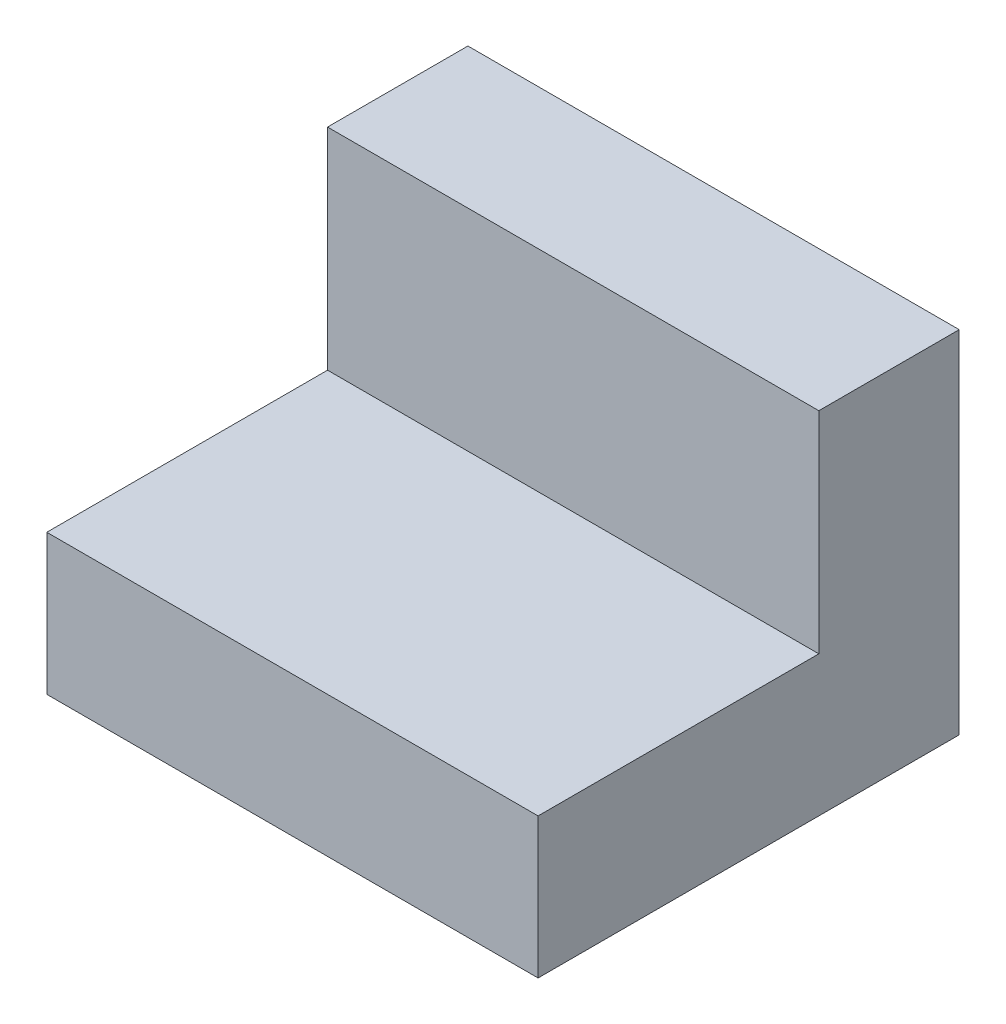
ISO-10303-21;
HEADER;
FILE_DESCRIPTION(('STEP AP214'),'2;1');
FILE_NAME('part.step','',(''),(''),'','','');
FILE_SCHEMA(('AUTOMOTIVE_DESIGN { 1 0 10303 214 1 1 1 1 }'));
ENDSEC;
DATA;
#1=APPLICATION_CONTEXT('core data for automotive mechanical design processes');
#2=APPLICATION_PROTOCOL_DEFINITION('international standard','automotive_design',2000,#1);
#3=PRODUCT_CONTEXT('',#1,'mechanical');
#4=PRODUCT('Part','Part','',(#3));
#5=PRODUCT_RELATED_PRODUCT_CATEGORY('part','',(#4));
#6=PRODUCT_DEFINITION_FORMATION('','',#4);
#7=PRODUCT_DEFINITION_CONTEXT('part definition',#1,'design');
#8=PRODUCT_DEFINITION('design','',#6,#7);
#9=PRODUCT_DEFINITION_SHAPE('','',#8);
#10=(LENGTH_UNIT() NAMED_UNIT(*) SI_UNIT(.MILLI.,.METRE.));
#11=(NAMED_UNIT(*) PLANE_ANGLE_UNIT() SI_UNIT($,.RADIAN.));
#12=(NAMED_UNIT(*) SI_UNIT($,.STERADIAN.) SOLID_ANGLE_UNIT());
#13=UNCERTAINTY_MEASURE_WITH_UNIT(LENGTH_MEASURE(1.E-05),#10,'distance_accuracy_value','');
#14=(GEOMETRIC_REPRESENTATION_CONTEXT(3) GLOBAL_UNCERTAINTY_ASSIGNED_CONTEXT((#13)) GLOBAL_UNIT_ASSIGNED_CONTEXT((#10,
#11,#12)) REPRESENTATION_CONTEXT('',''));
#15=CARTESIAN_POINT('',(0.,0.,0.));
#16=DIRECTION('',(0.,0.,1.));
#17=DIRECTION('',(1.,0.,0.));
#18=AXIS2_PLACEMENT_3D('',#15,#16,#17);
#19=CARTESIAN_POINT('',(0.,0.,40.));
#20=DIRECTION('',(1.,0.,0.));
#21=DIRECTION('',(0.,0.,-1.));
#22=AXIS2_PLACEMENT_3D('',#19,#20,#21);
#23=PLANE('',#22);
#24=DIRECTION('',(0.,0.,-1.));
#25=VECTOR('',#24,1.);
#26=CARTESIAN_POINT('',(0.,20.,40.));
#27=LINE('',#26,#25);
#28=CARTESIAN_POINT('',(0.,20.,40.));
#29=VERTEX_POINT('',#28);
#30=CARTESIAN_POINT('',(0.,20.,0.));
#31=VERTEX_POINT('',#30);
#32=EDGE_CURVE('E150',#29,#31,#27,.T.);
#33=ORIENTED_EDGE('',*,*,#32,.T.);
#34=DIRECTION('',(0.,1.,0.));
#35=VECTOR('',#34,1.);
#36=CARTESIAN_POINT('',(0.,0.,0.));
#37=LINE('',#36,#35);
#38=CARTESIAN_POINT('',(0.,50.,0.));
#39=VERTEX_POINT('',#38);
#40=EDGE_CURVE('E119',#31,#39,#37,.T.);
#41=ORIENTED_EDGE('',*,*,#40,.T.);
#42=DIRECTION('',(0.,0.,1.));
#43=VECTOR('',#42,1.);
#44=CARTESIAN_POINT('',(0.,50.,-20.));
#45=LINE('',#44,#43);
#46=CARTESIAN_POINT('',(0.,50.,-20.));
#47=VERTEX_POINT('',#46);
#48=EDGE_CURVE('E135',#47,#39,#45,.T.);
#49=ORIENTED_EDGE('',*,*,#48,.F.);
#50=DIRECTION('',(0.,1.,0.));
#51=VECTOR('',#50,1.);
#52=CARTESIAN_POINT('',(0.,0.,-20.));
#53=LINE('',#52,#51);
#54=CARTESIAN_POINT('',(0.,0.,-20.));
#55=VERTEX_POINT('',#54);
#56=EDGE_CURVE('E109',#55,#47,#53,.T.);
#57=ORIENTED_EDGE('',*,*,#56,.F.);
#58=DIRECTION('',(0.,0.,-1.));
#59=VECTOR('',#58,1.);
#60=CARTESIAN_POINT('',(0.,0.,40.));
#61=LINE('',#60,#59);
#62=CARTESIAN_POINT('',(0.,0.,40.));
#63=VERTEX_POINT('',#62);
#64=EDGE_CURVE('E11',#63,#55,#61,.T.);
#65=ORIENTED_EDGE('',*,*,#64,.F.);
#66=DIRECTION('',(0.,-1.,0.));
#67=VECTOR('',#66,1.);
#68=CARTESIAN_POINT('',(0.,0.,40.));
#69=LINE('',#68,#67);
#70=EDGE_CURVE('E140',#29,#63,#69,.T.);
#71=ORIENTED_EDGE('',*,*,#70,.F.);
#72=EDGE_LOOP('',(#33,#41,#49,#57,#65,#71));
#73=FACE_BOUND('',#72,.T.);
#74=ADVANCED_FACE('F43',(#73),#23,.F.);
#75=CARTESIAN_POINT('',(0.,0.,40.));
#76=DIRECTION('',(0.,1.,0.));
#77=DIRECTION('',(0.,0.,1.));
#78=AXIS2_PLACEMENT_3D('',#75,#76,#77);
#79=PLANE('',#78);
#80=ORIENTED_EDGE('',*,*,#64,.T.);
#81=DIRECTION('',(-1.,0.,0.));
#82=VECTOR('',#81,1.);
#83=CARTESIAN_POINT('',(70.,0.,-20.));
#84=LINE('',#83,#82);
#85=CARTESIAN_POINT('',(70.,0.,-20.));
#86=VERTEX_POINT('',#85);
#87=EDGE_CURVE('E103',#86,#55,#84,.T.);
#88=ORIENTED_EDGE('',*,*,#87,.F.);
#89=DIRECTION('',(0.,0.,-1.));
#90=VECTOR('',#89,1.);
#91=CARTESIAN_POINT('',(70.,0.,40.));
#92=LINE('',#91,#90);
#93=CARTESIAN_POINT('',(70.,0.,40.));
#94=VERTEX_POINT('',#93);
#95=EDGE_CURVE('E52',#94,#86,#92,.T.);
#96=ORIENTED_EDGE('',*,*,#95,.F.);
#97=DIRECTION('',(1.,0.,0.));
#98=VECTOR('',#97,1.);
#99=CARTESIAN_POINT('',(0.,0.,40.));
#100=LINE('',#99,#98);
#101=EDGE_CURVE('E143',#63,#94,#100,.T.);
#102=ORIENTED_EDGE('',*,*,#101,.F.);
#103=EDGE_LOOP('',(#80,#88,#96,#102));
#104=FACE_BOUND('',#103,.T.);
#105=ADVANCED_FACE('F104',(#104),#79,.F.);
#106=CARTESIAN_POINT('',(70.,0.,40.));
#107=DIRECTION('',(-1.,0.,0.));
#108=DIRECTION('',(0.,0.,1.));
#109=AXIS2_PLACEMENT_3D('',#106,#107,#108);
#110=PLANE('',#109);
#111=ORIENTED_EDGE('',*,*,#95,.T.);
#112=DIRECTION('',(0.,-1.,0.));
#113=VECTOR('',#112,1.);
#114=CARTESIAN_POINT('',(70.,0.,-20.));
#115=LINE('',#114,#113);
#116=CARTESIAN_POINT('',(70.,50.,-20.));
#117=VERTEX_POINT('',#116);
#118=EDGE_CURVE('E96',#117,#86,#115,.T.);
#119=ORIENTED_EDGE('',*,*,#118,.F.);
#120=DIRECTION('',(0.,0.,1.));
#121=VECTOR('',#120,1.);
#122=CARTESIAN_POINT('',(70.,50.,-20.));
#123=LINE('',#122,#121);
#124=CARTESIAN_POINT('',(70.,50.,0.));
#125=VERTEX_POINT('',#124);
#126=EDGE_CURVE('E126',#117,#125,#123,.T.);
#127=ORIENTED_EDGE('',*,*,#126,.T.);
#128=DIRECTION('',(0.,-1.,0.));
#129=VECTOR('',#128,1.);
#130=CARTESIAN_POINT('',(70.,0.,0.));
#131=LINE('',#130,#129);
#132=CARTESIAN_POINT('',(70.,20.,0.));
#133=VERTEX_POINT('',#132);
#134=EDGE_CURVE('E127',#125,#133,#131,.T.);
#135=ORIENTED_EDGE('',*,*,#134,.T.);
#136=DIRECTION('',(0.,0.,-1.));
#137=VECTOR('',#136,1.);
#138=CARTESIAN_POINT('',(70.,20.,40.));
#139=LINE('',#138,#137);
#140=CARTESIAN_POINT('',(70.,20.,40.));
#141=VERTEX_POINT('',#140);
#142=EDGE_CURVE('E101',#141,#133,#139,.T.);
#143=ORIENTED_EDGE('',*,*,#142,.F.);
#144=DIRECTION('',(0.,1.,0.));
#145=VECTOR('',#144,1.);
#146=CARTESIAN_POINT('',(70.,0.,40.));
#147=LINE('',#146,#145);
#148=EDGE_CURVE('E98',#94,#141,#147,.T.);
#149=ORIENTED_EDGE('',*,*,#148,.F.);
#150=EDGE_LOOP('',(#111,#119,#127,#135,#143,#149));
#151=FACE_BOUND('',#150,.T.);
#152=ADVANCED_FACE('F93',(#151),#110,.F.);
#153=CARTESIAN_POINT('',(0.,20.,40.));
#154=DIRECTION('',(0.,-1.,0.));
#155=DIRECTION('',(0.,0.,-1.));
#156=AXIS2_PLACEMENT_3D('',#153,#154,#155);
#157=PLANE('',#156);
#158=DIRECTION('',(-1.,0.,0.));
#159=VECTOR('',#158,1.);
#160=CARTESIAN_POINT('',(0.,20.,0.));
#161=LINE('',#160,#159);
#162=EDGE_CURVE('E139',#133,#31,#161,.T.);
#163=ORIENTED_EDGE('',*,*,#162,.T.);
#164=ORIENTED_EDGE('',*,*,#32,.F.);
#165=DIRECTION('',(-1.,0.,0.));
#166=VECTOR('',#165,1.);
#167=CARTESIAN_POINT('',(0.,20.,40.));
#168=LINE('',#167,#166);
#169=EDGE_CURVE('E59',#141,#29,#168,.T.);
#170=ORIENTED_EDGE('',*,*,#169,.F.);
#171=ORIENTED_EDGE('',*,*,#142,.T.);
#172=EDGE_LOOP('',(#163,#164,#170,#171));
#173=FACE_BOUND('',#172,.T.);
#174=ADVANCED_FACE('F160',(#173),#157,.F.);
#175=CARTESIAN_POINT('',(0.,0.,40.));
#176=DIRECTION('',(0.,0.,-1.));
#177=DIRECTION('',(-1.,0.,0.));
#178=AXIS2_PLACEMENT_3D('',#175,#176,#177);
#179=PLANE('',#178);
#180=ORIENTED_EDGE('',*,*,#70,.T.);
#181=ORIENTED_EDGE('',*,*,#101,.T.);
#182=ORIENTED_EDGE('',*,*,#148,.T.);
#183=ORIENTED_EDGE('',*,*,#169,.T.);
#184=EDGE_LOOP('',(#180,#181,#182,#183));
#185=FACE_BOUND('',#184,.T.);
#186=ADVANCED_FACE('F178',(#185),#179,.F.);
#187=CARTESIAN_POINT('',(0.,0.,0.));
#188=DIRECTION('',(0.,0.,1.));
#189=DIRECTION('',(1.,0.,0.));
#190=AXIS2_PLACEMENT_3D('',#187,#188,#189);
#191=PLANE('',#190);
#192=ORIENTED_EDGE('',*,*,#162,.F.);
#193=ORIENTED_EDGE('',*,*,#134,.F.);
#194=DIRECTION('',(1.,0.,0.));
#195=VECTOR('',#194,1.);
#196=CARTESIAN_POINT('',(70.,50.,0.));
#197=LINE('',#196,#195);
#198=EDGE_CURVE('E116',#39,#125,#197,.T.);
#199=ORIENTED_EDGE('',*,*,#198,.F.);
#200=ORIENTED_EDGE('',*,*,#40,.F.);
#201=EDGE_LOOP('',(#192,#193,#199,#200));
#202=FACE_BOUND('',#201,.T.);
#203=ADVANCED_FACE('F164',(#202),#191,.T.);
#204=CARTESIAN_POINT('',(70.,50.,-20.));
#205=DIRECTION('',(0.,-1.,0.));
#206=DIRECTION('',(0.,0.,-1.));
#207=AXIS2_PLACEMENT_3D('',#204,#205,#206);
#208=PLANE('',#207);
#209=ORIENTED_EDGE('',*,*,#198,.T.);
#210=ORIENTED_EDGE('',*,*,#126,.F.);
#211=DIRECTION('',(1.,0.,0.));
#212=VECTOR('',#211,1.);
#213=CARTESIAN_POINT('',(70.,50.,-20.));
#214=LINE('',#213,#212);
#215=EDGE_CURVE('E113',#47,#117,#214,.T.);
#216=ORIENTED_EDGE('',*,*,#215,.F.);
#217=ORIENTED_EDGE('',*,*,#48,.T.);
#218=EDGE_LOOP('',(#209,#210,#216,#217));
#219=FACE_BOUND('',#218,.T.);
#220=ADVANCED_FACE('F170',(#219),#208,.F.);
#221=CARTESIAN_POINT('',(0.,0.,-20.));
#222=DIRECTION('',(0.,0.,1.));
#223=DIRECTION('',(1.,0.,0.));
#224=AXIS2_PLACEMENT_3D('',#221,#222,#223);
#225=PLANE('',#224);
#226=ORIENTED_EDGE('',*,*,#118,.T.);
#227=ORIENTED_EDGE('',*,*,#87,.T.);
#228=ORIENTED_EDGE('',*,*,#56,.T.);
#229=ORIENTED_EDGE('',*,*,#215,.T.);
#230=EDGE_LOOP('',(#226,#227,#228,#229));
#231=FACE_BOUND('',#230,.T.);
#232=ADVANCED_FACE('F111',(#231),#225,.F.);
#233=CLOSED_SHELL('',(#74,#105,#152,#174,#186,#203,#220,#232));
#234=MANIFOLD_SOLID_BREP('B2',#233);
#235=ADVANCED_BREP_SHAPE_REPRESENTATION('',(#18,#234),#14);
#236=SHAPE_DEFINITION_REPRESENTATION(#9,#235);
ENDSEC;
END-ISO-10303-21;
